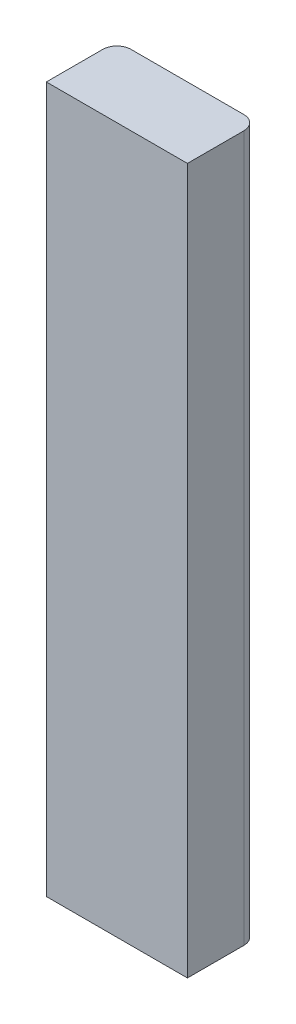
ISO-10303-21;
HEADER;
FILE_DESCRIPTION(('STEP AP214'),'2;1');
FILE_NAME('part.step','',(''),(''),'','','');
FILE_SCHEMA(('AUTOMOTIVE_DESIGN { 1 0 10303 214 1 1 1 1 }'));
ENDSEC;
DATA;
#1=APPLICATION_CONTEXT('core data for automotive mechanical design processes');
#2=APPLICATION_PROTOCOL_DEFINITION('international standard','automotive_design',2000,#1);
#3=PRODUCT_CONTEXT('',#1,'mechanical');
#4=PRODUCT('Part','Part','',(#3));
#5=PRODUCT_RELATED_PRODUCT_CATEGORY('part','',(#4));
#6=PRODUCT_DEFINITION_FORMATION('','',#4);
#7=PRODUCT_DEFINITION_CONTEXT('part definition',#1,'design');
#8=PRODUCT_DEFINITION('design','',#6,#7);
#9=PRODUCT_DEFINITION_SHAPE('','',#8);
#10=(LENGTH_UNIT() NAMED_UNIT(*) SI_UNIT(.MILLI.,.METRE.));
#11=(NAMED_UNIT(*) PLANE_ANGLE_UNIT() SI_UNIT($,.RADIAN.));
#12=(NAMED_UNIT(*) SI_UNIT($,.STERADIAN.) SOLID_ANGLE_UNIT());
#13=UNCERTAINTY_MEASURE_WITH_UNIT(LENGTH_MEASURE(1.E-05),#10,'distance_accuracy_value','');
#14=(GEOMETRIC_REPRESENTATION_CONTEXT(3) GLOBAL_UNCERTAINTY_ASSIGNED_CONTEXT((#13)) GLOBAL_UNIT_ASSIGNED_CONTEXT((#10,
#11,#12)) REPRESENTATION_CONTEXT('',''));
#15=CARTESIAN_POINT('',(0.,0.,0.));
#16=DIRECTION('',(0.,0.,1.));
#17=DIRECTION('',(1.,0.,0.));
#18=AXIS2_PLACEMENT_3D('',#15,#16,#17);
#19=CARTESIAN_POINT('',(25.4,127.,0.));
#20=DIRECTION('',(0.,0.,-1.));
#21=DIRECTION('',(-1.,0.,0.));
#22=AXIS2_PLACEMENT_3D('',#19,#20,#21);
#23=PLANE('',#22);
#24=DIRECTION('',(1.,0.,0.));
#25=VECTOR('',#24,1.);
#26=CARTESIAN_POINT('',(25.4,0.,0.));
#27=LINE('',#26,#25);
#28=CARTESIAN_POINT('',(0.,0.,0.));
#29=VERTEX_POINT('',#28);
#30=CARTESIAN_POINT('',(25.4,0.,0.));
#31=VERTEX_POINT('',#30);
#32=EDGE_CURVE('E106',#29,#31,#27,.T.);
#33=ORIENTED_EDGE('',*,*,#32,.T.);
#34=DIRECTION('',(0.,-1.,0.));
#35=VECTOR('',#34,1.);
#36=CARTESIAN_POINT('',(25.4,127.,0.));
#37=LINE('',#36,#35);
#38=CARTESIAN_POINT('',(25.4,127.,0.));
#39=VERTEX_POINT('',#38);
#40=EDGE_CURVE('E89',#39,#31,#37,.T.);
#41=ORIENTED_EDGE('',*,*,#40,.F.);
#42=DIRECTION('',(1.,0.,0.));
#43=VECTOR('',#42,1.);
#44=CARTESIAN_POINT('',(25.4,127.,0.));
#45=LINE('',#44,#43);
#46=CARTESIAN_POINT('',(0.,127.,0.));
#47=VERTEX_POINT('',#46);
#48=EDGE_CURVE('E94',#47,#39,#45,.T.);
#49=ORIENTED_EDGE('',*,*,#48,.F.);
#50=DIRECTION('',(0.,-1.,0.));
#51=VECTOR('',#50,1.);
#52=CARTESIAN_POINT('',(0.,127.,0.));
#53=LINE('',#52,#51);
#54=EDGE_CURVE('E108',#47,#29,#53,.T.);
#55=ORIENTED_EDGE('',*,*,#54,.T.);
#56=EDGE_LOOP('',(#33,#41,#49,#55));
#57=FACE_BOUND('',#56,.T.);
#58=ADVANCED_FACE('F33',(#57),#23,.F.);
#59=CARTESIAN_POINT('',(25.4,127.,-12.7));
#60=DIRECTION('',(-1.,0.,0.));
#61=DIRECTION('',(0.,0.,1.));
#62=AXIS2_PLACEMENT_3D('',#59,#60,#61);
#63=PLANE('',#62);
#64=DIRECTION('',(0.,0.,-1.));
#65=VECTOR('',#64,1.);
#66=CARTESIAN_POINT('',(25.4,0.,-12.7));
#67=LINE('',#66,#65);
#68=CARTESIAN_POINT('',(25.4,0.,-10.16));
#69=VERTEX_POINT('',#68);
#70=EDGE_CURVE('E138',#31,#69,#67,.T.);
#71=ORIENTED_EDGE('',*,*,#70,.T.);
#72=DIRECTION('',(0.,-1.,0.));
#73=VECTOR('',#72,1.);
#74=CARTESIAN_POINT('',(25.4,127.,-10.16));
#75=LINE('',#74,#73);
#76=CARTESIAN_POINT('',(25.4,127.,-10.16));
#77=VERTEX_POINT('',#76);
#78=EDGE_CURVE('E11',#69,#77,#75,.F.);
#79=ORIENTED_EDGE('',*,*,#78,.T.);
#80=DIRECTION('',(0.,0.,-1.));
#81=VECTOR('',#80,1.);
#82=CARTESIAN_POINT('',(25.4,127.,-12.7));
#83=LINE('',#82,#81);
#84=EDGE_CURVE('E85',#39,#77,#83,.T.);
#85=ORIENTED_EDGE('',*,*,#84,.F.);
#86=ORIENTED_EDGE('',*,*,#40,.T.);
#87=EDGE_LOOP('',(#71,#79,#85,#86));
#88=FACE_BOUND('',#87,.T.);
#89=ADVANCED_FACE('F87',(#88),#63,.F.);
#90=CARTESIAN_POINT('',(0.,127.,-12.7));
#91=DIRECTION('',(0.,0.,1.));
#92=DIRECTION('',(1.,0.,0.));
#93=AXIS2_PLACEMENT_3D('',#90,#91,#92);
#94=PLANE('',#93);
#95=DIRECTION('',(-1.,0.,0.));
#96=VECTOR('',#95,1.);
#97=CARTESIAN_POINT('',(0.,0.,-12.7));
#98=LINE('',#97,#96);
#99=CARTESIAN_POINT('',(22.86,0.,-12.7));
#100=VERTEX_POINT('',#99);
#101=CARTESIAN_POINT('',(2.54,0.,-12.7));
#102=VERTEX_POINT('',#101);
#103=EDGE_CURVE('E135',#100,#102,#98,.T.);
#104=ORIENTED_EDGE('',*,*,#103,.T.);
#105=DIRECTION('',(0.,-1.,0.));
#106=VECTOR('',#105,1.);
#107=CARTESIAN_POINT('',(2.54,127.,-12.7));
#108=LINE('',#107,#106);
#109=CARTESIAN_POINT('',(2.54,127.,-12.7));
#110=VERTEX_POINT('',#109);
#111=EDGE_CURVE('E54',#102,#110,#108,.F.);
#112=ORIENTED_EDGE('',*,*,#111,.T.);
#113=DIRECTION('',(-1.,0.,0.));
#114=VECTOR('',#113,1.);
#115=CARTESIAN_POINT('',(0.,127.,-12.7));
#116=LINE('',#115,#114);
#117=CARTESIAN_POINT('',(22.86,127.,-12.7));
#118=VERTEX_POINT('',#117);
#119=EDGE_CURVE('E93',#118,#110,#116,.T.);
#120=ORIENTED_EDGE('',*,*,#119,.F.);
#121=DIRECTION('',(0.,-1.,0.));
#122=VECTOR('',#121,1.);
#123=CARTESIAN_POINT('',(22.86,127.,-12.7));
#124=LINE('',#123,#122);
#125=EDGE_CURVE('E119',#118,#100,#124,.T.);
#126=ORIENTED_EDGE('',*,*,#125,.T.);
#127=EDGE_LOOP('',(#104,#112,#120,#126));
#128=FACE_BOUND('',#127,.T.);
#129=ADVANCED_FACE('F136',(#128),#94,.F.);
#130=CARTESIAN_POINT('',(0.,127.,0.));
#131=DIRECTION('',(1.,0.,0.));
#132=DIRECTION('',(0.,0.,-1.));
#133=AXIS2_PLACEMENT_3D('',#130,#131,#132);
#134=PLANE('',#133);
#135=DIRECTION('',(0.,0.,1.));
#136=VECTOR('',#135,1.);
#137=CARTESIAN_POINT('',(0.,127.,0.));
#138=LINE('',#137,#136);
#139=CARTESIAN_POINT('',(0.,127.,-10.16));
#140=VERTEX_POINT('',#139);
#141=EDGE_CURVE('E99',#140,#47,#138,.T.);
#142=ORIENTED_EDGE('',*,*,#141,.F.);
#143=DIRECTION('',(0.,-1.,0.));
#144=VECTOR('',#143,1.);
#145=CARTESIAN_POINT('',(0.,127.,-10.16));
#146=LINE('',#145,#144);
#147=CARTESIAN_POINT('',(0.,0.,-10.16));
#148=VERTEX_POINT('',#147);
#149=EDGE_CURVE('E107',#140,#148,#146,.T.);
#150=ORIENTED_EDGE('',*,*,#149,.T.);
#151=DIRECTION('',(0.,0.,1.));
#152=VECTOR('',#151,1.);
#153=CARTESIAN_POINT('',(0.,0.,0.));
#154=LINE('',#153,#152);
#155=EDGE_CURVE('E103',#148,#29,#154,.T.);
#156=ORIENTED_EDGE('',*,*,#155,.T.);
#157=ORIENTED_EDGE('',*,*,#54,.F.);
#158=EDGE_LOOP('',(#142,#150,#156,#157));
#159=FACE_BOUND('',#158,.T.);
#160=ADVANCED_FACE('F128',(#159),#134,.F.);
#161=CARTESIAN_POINT('',(0.,127.,0.));
#162=DIRECTION('',(0.,-1.,0.));
#163=DIRECTION('',(0.,0.,-1.));
#164=AXIS2_PLACEMENT_3D('',#161,#162,#163);
#165=PLANE('',#164);
#166=ORIENTED_EDGE('',*,*,#119,.T.);
#167=CARTESIAN_POINT('',(2.54,127.,-10.16));
#168=DIRECTION('',(0.,-1.,0.));
#169=DIRECTION('',(0.,0.,-1.));
#170=AXIS2_PLACEMENT_3D('',#167,#168,#169);
#171=CIRCLE('',#170,2.54);
#172=EDGE_CURVE('E41',#110,#140,#171,.F.);
#173=ORIENTED_EDGE('',*,*,#172,.T.);
#174=ORIENTED_EDGE('',*,*,#141,.T.);
#175=ORIENTED_EDGE('',*,*,#48,.T.);
#176=ORIENTED_EDGE('',*,*,#84,.T.);
#177=CARTESIAN_POINT('',(22.86,127.,-10.16));
#178=DIRECTION('',(0.,-1.,0.));
#179=DIRECTION('',(0.,0.,-1.));
#180=AXIS2_PLACEMENT_3D('',#177,#178,#179);
#181=CIRCLE('',#180,2.54);
#182=EDGE_CURVE('E123',#77,#118,#181,.F.);
#183=ORIENTED_EDGE('',*,*,#182,.T.);
#184=EDGE_LOOP('',(#166,#173,#174,#175,#176,#183));
#185=FACE_BOUND('',#184,.T.);
#186=ADVANCED_FACE('F97',(#185),#165,.F.);
#187=CARTESIAN_POINT('',(0.,0.,0.));
#188=DIRECTION('',(0.,-1.,0.));
#189=DIRECTION('',(0.,0.,-1.));
#190=AXIS2_PLACEMENT_3D('',#187,#188,#189);
#191=PLANE('',#190);
#192=ORIENTED_EDGE('',*,*,#155,.F.);
#193=CARTESIAN_POINT('',(2.54,0.,-10.16));
#194=DIRECTION('',(0.,-1.,0.));
#195=DIRECTION('',(0.,0.,-1.));
#196=AXIS2_PLACEMENT_3D('',#193,#194,#195);
#197=CIRCLE('',#196,2.54);
#198=EDGE_CURVE('E117',#148,#102,#197,.T.);
#199=ORIENTED_EDGE('',*,*,#198,.T.);
#200=ORIENTED_EDGE('',*,*,#103,.F.);
#201=CARTESIAN_POINT('',(22.86,0.,-10.16));
#202=DIRECTION('',(0.,-1.,0.));
#203=DIRECTION('',(0.,0.,-1.));
#204=AXIS2_PLACEMENT_3D('',#201,#202,#203);
#205=CIRCLE('',#204,2.54);
#206=EDGE_CURVE('E111',#100,#69,#205,.T.);
#207=ORIENTED_EDGE('',*,*,#206,.T.);
#208=ORIENTED_EDGE('',*,*,#70,.F.);
#209=ORIENTED_EDGE('',*,*,#32,.F.);
#210=EDGE_LOOP('',(#192,#199,#200,#207,#208,#209));
#211=FACE_BOUND('',#210,.T.);
#212=ADVANCED_FACE('F134',(#211),#191,.T.);
#213=CARTESIAN_POINT('',(2.54,127.,-10.16));
#214=DIRECTION('',(0.,-1.,0.));
#215=DIRECTION('',(0.,0.,-1.));
#216=AXIS2_PLACEMENT_3D('',#213,#214,#215);
#217=CYLINDRICAL_SURFACE('',#216,2.54);
#218=ORIENTED_EDGE('',*,*,#172,.F.);
#219=ORIENTED_EDGE('',*,*,#111,.F.);
#220=ORIENTED_EDGE('',*,*,#198,.F.);
#221=ORIENTED_EDGE('',*,*,#149,.F.);
#222=EDGE_LOOP('',(#218,#219,#220,#221));
#223=FACE_BOUND('',#222,.T.);
#224=ADVANCED_FACE('F131',(#223),#217,.T.);
#225=CARTESIAN_POINT('',(22.86,127.,-10.16));
#226=DIRECTION('',(0.,-1.,0.));
#227=DIRECTION('',(0.,0.,-1.));
#228=AXIS2_PLACEMENT_3D('',#225,#226,#227);
#229=CYLINDRICAL_SURFACE('',#228,2.54);
#230=ORIENTED_EDGE('',*,*,#182,.F.);
#231=ORIENTED_EDGE('',*,*,#78,.F.);
#232=ORIENTED_EDGE('',*,*,#206,.F.);
#233=ORIENTED_EDGE('',*,*,#125,.F.);
#234=EDGE_LOOP('',(#230,#231,#232,#233));
#235=FACE_BOUND('',#234,.T.);
#236=ADVANCED_FACE('F35',(#235),#229,.T.);
#237=CLOSED_SHELL('',(#58,#89,#129,#160,#186,#212,#224,#236));
#238=MANIFOLD_SOLID_BREP('B2',#237);
#239=ADVANCED_BREP_SHAPE_REPRESENTATION('',(#18,#238),#14);
#240=SHAPE_DEFINITION_REPRESENTATION(#9,#239);
ENDSEC;
END-ISO-10303-21;
